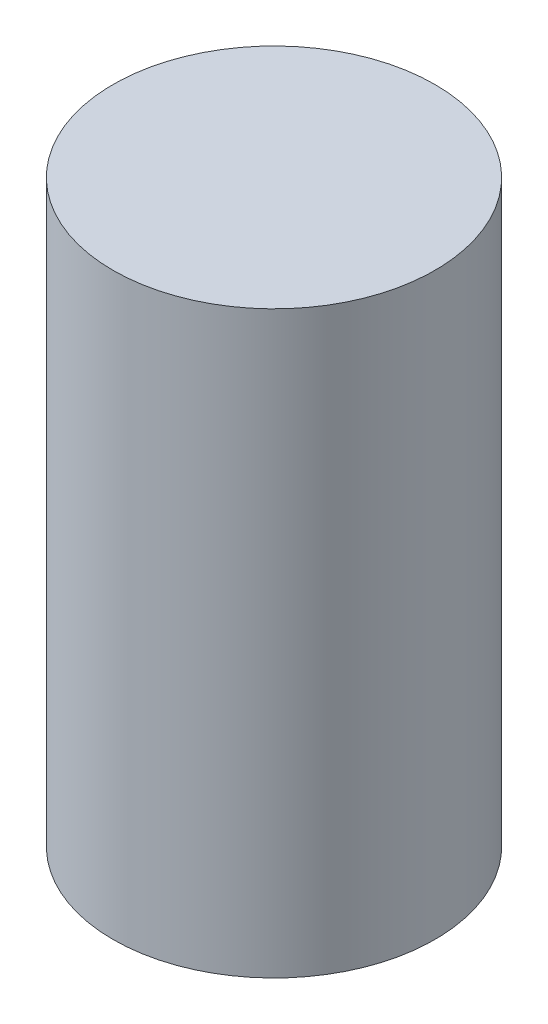
ISO-10303-21;
HEADER;
FILE_DESCRIPTION(('STEP AP214'),'2;1');
FILE_NAME('part.step','',(''),(''),'','','');
FILE_SCHEMA(('AUTOMOTIVE_DESIGN { 1 0 10303 214 1 1 1 1 }'));
ENDSEC;
DATA;
#1=APPLICATION_CONTEXT('core data for automotive mechanical design processes');
#2=APPLICATION_PROTOCOL_DEFINITION('international standard','automotive_design',2000,#1);
#3=PRODUCT_CONTEXT('',#1,'mechanical');
#4=PRODUCT('Part','Part','',(#3));
#5=PRODUCT_RELATED_PRODUCT_CATEGORY('part','',(#4));
#6=PRODUCT_DEFINITION_FORMATION('','',#4);
#7=PRODUCT_DEFINITION_CONTEXT('part definition',#1,'design');
#8=PRODUCT_DEFINITION('design','',#6,#7);
#9=PRODUCT_DEFINITION_SHAPE('','',#8);
#10=(LENGTH_UNIT() NAMED_UNIT(*) SI_UNIT(.MILLI.,.METRE.));
#11=(NAMED_UNIT(*) PLANE_ANGLE_UNIT() SI_UNIT($,.RADIAN.));
#12=(NAMED_UNIT(*) SI_UNIT($,.STERADIAN.) SOLID_ANGLE_UNIT());
#13=UNCERTAINTY_MEASURE_WITH_UNIT(LENGTH_MEASURE(1.E-05),#10,'distance_accuracy_value','');
#14=(GEOMETRIC_REPRESENTATION_CONTEXT(3) GLOBAL_UNCERTAINTY_ASSIGNED_CONTEXT((#13)) GLOBAL_UNIT_ASSIGNED_CONTEXT((#10,
#11,#12)) REPRESENTATION_CONTEXT('',''));
#15=CARTESIAN_POINT('',(0.,0.,0.));
#16=DIRECTION('',(0.,0.,1.));
#17=DIRECTION('',(1.,0.,0.));
#18=AXIS2_PLACEMENT_3D('',#15,#16,#17);
#19=CARTESIAN_POINT('',(-33.6117367177031,36.,0.));
#20=DIRECTION('',(0.,-1.,0.));
#21=DIRECTION('',(0.,0.,-1.));
#22=AXIS2_PLACEMENT_3D('',#19,#20,#21);
#23=CYLINDRICAL_SURFACE('',#22,10.);
#24=CARTESIAN_POINT('',(-33.6117367177031,36.,0.));
#25=DIRECTION('',(0.,1.,0.));
#26=DIRECTION('',(0.,0.,1.));
#27=AXIS2_PLACEMENT_3D('',#24,#25,#26);
#28=CIRCLE('',#27,10.);
#29=CARTESIAN_POINT('',(-33.6117367177031,36.,10.));
#30=VERTEX_POINT('',#29);
#31=EDGE_CURVE('E10',#30,#30,#28,.T.);
#32=ORIENTED_EDGE('',*,*,#31,.F.);
#33=EDGE_LOOP('',(#32));
#34=FACE_BOUND('',#33,.T.);
#35=CARTESIAN_POINT('',(-33.6117367177031,0.,0.));
#36=DIRECTION('',(0.,1.,0.));
#37=DIRECTION('',(0.,0.,1.));
#38=AXIS2_PLACEMENT_3D('',#35,#36,#37);
#39=CIRCLE('',#38,10.);
#40=CARTESIAN_POINT('',(-33.6117367177031,0.,10.));
#41=VERTEX_POINT('',#40);
#42=EDGE_CURVE('E39',#41,#41,#39,.T.);
#43=ORIENTED_EDGE('',*,*,#42,.T.);
#44=EDGE_LOOP('',(#43));
#45=FACE_BOUND('',#44,.T.);
#46=ADVANCED_FACE('F36',(#34,#45),#23,.T.);
#47=CARTESIAN_POINT('',(-33.6117367177031,36.,0.));
#48=DIRECTION('',(0.,1.,0.));
#49=DIRECTION('',(0.,0.,1.));
#50=AXIS2_PLACEMENT_3D('',#47,#48,#49);
#51=PLANE('',#50);
#52=ORIENTED_EDGE('',*,*,#31,.T.);
#53=EDGE_LOOP('',(#52));
#54=FACE_BOUND('',#53,.T.);
#55=ADVANCED_FACE('F53',(#54),#51,.T.);
#56=CARTESIAN_POINT('',(-33.6117367177031,0.,0.));
#57=DIRECTION('',(0.,1.,0.));
#58=DIRECTION('',(0.,0.,1.));
#59=AXIS2_PLACEMENT_3D('',#56,#57,#58);
#60=PLANE('',#59);
#61=ORIENTED_EDGE('',*,*,#42,.F.);
#62=EDGE_LOOP('',(#61));
#63=FACE_BOUND('',#62,.T.);
#64=ADVANCED_FACE('F51',(#63),#60,.F.);
#65=CLOSED_SHELL('',(#46,#55,#64));
#66=MANIFOLD_SOLID_BREP('B2',#65);
#67=ADVANCED_BREP_SHAPE_REPRESENTATION('',(#18,#66),#14);
#68=SHAPE_DEFINITION_REPRESENTATION(#9,#67);
ENDSEC;
END-ISO-10303-21;
